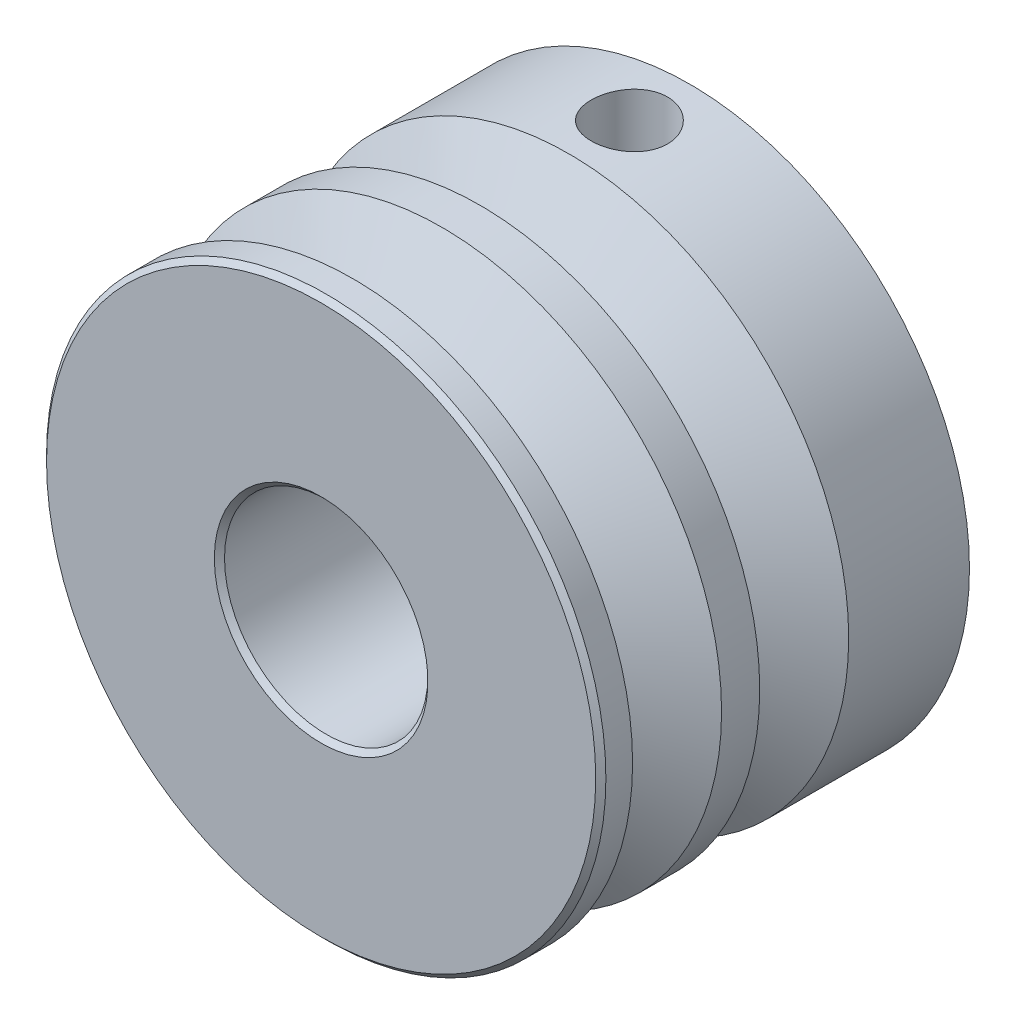
ISO-10303-21;
HEADER;
FILE_DESCRIPTION(('STEP AP214'),'2;1');
FILE_NAME('part.step','',(''),(''),'','','');
FILE_SCHEMA(('AUTOMOTIVE_DESIGN { 1 0 10303 214 1 1 1 1 }'));
ENDSEC;
DATA;
#1=APPLICATION_CONTEXT('core data for automotive mechanical design processes');
#2=APPLICATION_PROTOCOL_DEFINITION('international standard','automotive_design',2000,#1);
#3=PRODUCT_CONTEXT('',#1,'mechanical');
#4=PRODUCT('Part','Part','',(#3));
#5=PRODUCT_RELATED_PRODUCT_CATEGORY('part','',(#4));
#6=PRODUCT_DEFINITION_FORMATION('','',#4);
#7=PRODUCT_DEFINITION_CONTEXT('part definition',#1,'design');
#8=PRODUCT_DEFINITION('design','',#6,#7);
#9=PRODUCT_DEFINITION_SHAPE('','',#8);
#10=(LENGTH_UNIT() NAMED_UNIT(*) SI_UNIT(.MILLI.,.METRE.));
#11=(NAMED_UNIT(*) PLANE_ANGLE_UNIT() SI_UNIT($,.RADIAN.));
#12=(NAMED_UNIT(*) SI_UNIT($,.STERADIAN.) SOLID_ANGLE_UNIT());
#13=UNCERTAINTY_MEASURE_WITH_UNIT(LENGTH_MEASURE(1.E-05),#10,'distance_accuracy_value','');
#14=(GEOMETRIC_REPRESENTATION_CONTEXT(3) GLOBAL_UNCERTAINTY_ASSIGNED_CONTEXT((#13)) GLOBAL_UNIT_ASSIGNED_CONTEXT((#10,
#11,#12)) REPRESENTATION_CONTEXT('',''));
#15=CARTESIAN_POINT('',(0.,0.,0.));
#16=DIRECTION('',(0.,0.,1.));
#17=DIRECTION('',(1.,0.,0.));
#18=AXIS2_PLACEMENT_3D('',#15,#16,#17);
#19=CARTESIAN_POINT('',(0.,11.,0.));
#20=DIRECTION('',(0.,0.,-1.));
#21=DIRECTION('',(-1.,0.,0.));
#22=AXIS2_PLACEMENT_3D('',#19,#20,#21);
#23=PLANE('',#22);
#24=CARTESIAN_POINT('',(0.,0.,0.));
#25=DIRECTION('',(0.,0.,-1.));
#26=DIRECTION('',(-1.,0.,0.));
#27=AXIS2_PLACEMENT_3D('',#24,#25,#26);
#28=CIRCLE('',#27,10.8);
#29=CARTESIAN_POINT('',(-10.8,0.,0.));
#30=VERTEX_POINT('',#29);
#31=EDGE_CURVE('E58',#30,#30,#28,.F.);
#32=ORIENTED_EDGE('',*,*,#31,.T.);
#33=EDGE_LOOP('',(#32));
#34=FACE_BOUND('',#33,.T.);
#35=CARTESIAN_POINT('',(0.,0.,0.));
#36=DIRECTION('',(0.,0.,-1.));
#37=DIRECTION('',(-1.,0.,0.));
#38=AXIS2_PLACEMENT_3D('',#35,#36,#37);
#39=CIRCLE('',#38,4.2);
#40=CARTESIAN_POINT('',(-4.2,0.,0.));
#41=VERTEX_POINT('',#40);
#42=EDGE_CURVE('E61',#41,#41,#39,.T.);
#43=ORIENTED_EDGE('',*,*,#42,.T.);
#44=EDGE_LOOP('',(#43));
#45=FACE_BOUND('',#44,.T.);
#46=ADVANCED_FACE('F32',(#34,#45),#23,.F.);
#47=CARTESIAN_POINT('',(0.,0.,0.));
#48=DIRECTION('',(0.,0.,1.));
#49=DIRECTION('',(1.,0.,0.));
#50=AXIS2_PLACEMENT_3D('',#47,#48,#49);
#51=CYLINDRICAL_SURFACE('',#50,11.);
#52=CARTESIAN_POINT('',(0.,0.,-0.200000000000005));
#53=DIRECTION('',(0.,0.,-1.));
#54=DIRECTION('',(-1.,0.,0.));
#55=AXIS2_PLACEMENT_3D('',#52,#53,#54);
#56=CIRCLE('',#55,11.);
#57=CARTESIAN_POINT('',(-11.,0.,-0.200000000000005));
#58=VERTEX_POINT('',#57);
#59=EDGE_CURVE('E55',#58,#58,#56,.T.);
#60=ORIENTED_EDGE('',*,*,#59,.T.);
#61=EDGE_LOOP('',(#60));
#62=FACE_BOUND('',#61,.T.);
#63=CARTESIAN_POINT('',(0.,0.,-1.25));
#64=DIRECTION('',(0.,0.,1.));
#65=DIRECTION('',(1.,0.,0.));
#66=AXIS2_PLACEMENT_3D('',#63,#64,#65);
#67=CIRCLE('',#66,11.);
#68=CARTESIAN_POINT('',(11.,0.,-1.25));
#69=VERTEX_POINT('',#68);
#70=EDGE_CURVE('E186',#69,#69,#67,.T.);
#71=ORIENTED_EDGE('',*,*,#70,.T.);
#72=EDGE_LOOP('',(#71));
#73=FACE_BOUND('',#72,.T.);
#74=ADVANCED_FACE('F125',(#62,#73),#51,.T.);
#75=CARTESIAN_POINT('',(0.,0.,-2.91339745962156));
#76=DIRECTION('',(0.,0.,1.));
#77=DIRECTION('',(1.,0.,0.));
#78=AXIS2_PLACEMENT_3D('',#75,#76,#77);
#79=CONICAL_SURFACE('',#78,8.11891108675445,1.0471975511966);
#80=ORIENTED_EDGE('',*,*,#70,.F.);
#81=EDGE_LOOP('',(#80));
#82=FACE_BOUND('',#81,.T.);
#83=CARTESIAN_POINT('',(0.,0.,-2.91339745962156));
#84=DIRECTION('',(0.,0.,1.));
#85=DIRECTION('',(1.,0.,0.));
#86=AXIS2_PLACEMENT_3D('',#83,#84,#85);
#87=CIRCLE('',#86,8.11891108675445);
#88=CARTESIAN_POINT('',(8.11891108675445,0.,-2.91339745962156));
#89=VERTEX_POINT('',#88);
#90=EDGE_CURVE('E184',#89,#89,#87,.T.);
#91=ORIENTED_EDGE('',*,*,#90,.T.);
#92=EDGE_LOOP('',(#91));
#93=FACE_BOUND('',#92,.T.);
#94=ADVANCED_FACE('F131',(#82,#93),#79,.T.);
#95=CARTESIAN_POINT('',(0.,0.,-3.));
#96=DIRECTION('',(0.,0.,1.));
#97=DIRECTION('',(1.,0.,0.));
#98=AXIS2_PLACEMENT_3D('',#95,#96,#97);
#99=TOROIDAL_SURFACE('',#98,8.16891108675445,0.0999999999999997);
#100=ORIENTED_EDGE('',*,*,#90,.F.);
#101=EDGE_LOOP('',(#100));
#102=FACE_BOUND('',#101,.T.);
#103=CARTESIAN_POINT('',(0.,0.,-3.08660254037844));
#104=DIRECTION('',(0.,0.,1.));
#105=DIRECTION('',(1.,0.,0.));
#106=AXIS2_PLACEMENT_3D('',#103,#104,#105);
#107=CIRCLE('',#106,8.11891108675445);
#108=CARTESIAN_POINT('',(8.11891108675445,0.,-3.08660254037844));
#109=VERTEX_POINT('',#108);
#110=EDGE_CURVE('E181',#109,#109,#107,.T.);
#111=ORIENTED_EDGE('',*,*,#110,.T.);
#112=EDGE_LOOP('',(#111));
#113=FACE_BOUND('',#112,.T.);
#114=ADVANCED_FACE('F319',(#102,#113),#99,.F.);
#115=CARTESIAN_POINT('',(0.,0.,-4.75));
#116=DIRECTION('',(0.,0.,-1.));
#117=DIRECTION('',(-1.,0.,0.));
#118=AXIS2_PLACEMENT_3D('',#115,#116,#117);
#119=CONICAL_SURFACE('',#118,11.,1.0471975511966);
#120=ORIENTED_EDGE('',*,*,#110,.F.);
#121=EDGE_LOOP('',(#120));
#122=FACE_BOUND('',#121,.T.);
#123=CARTESIAN_POINT('',(0.,0.,-4.75));
#124=DIRECTION('',(0.,0.,1.));
#125=DIRECTION('',(1.,0.,0.));
#126=AXIS2_PLACEMENT_3D('',#123,#124,#125);
#127=CIRCLE('',#126,11.);
#128=CARTESIAN_POINT('',(11.,0.,-4.75));
#129=VERTEX_POINT('',#128);
#130=EDGE_CURVE('E178',#129,#129,#127,.T.);
#131=ORIENTED_EDGE('',*,*,#130,.T.);
#132=EDGE_LOOP('',(#131));
#133=FACE_BOUND('',#132,.T.);
#134=ADVANCED_FACE('F309',(#122,#133),#119,.T.);
#135=CARTESIAN_POINT('',(0.,0.,0.));
#136=DIRECTION('',(0.,0.,1.));
#137=DIRECTION('',(1.,0.,0.));
#138=AXIS2_PLACEMENT_3D('',#135,#136,#137);
#139=CYLINDRICAL_SURFACE('',#138,11.);
#140=ORIENTED_EDGE('',*,*,#130,.F.);
#141=EDGE_LOOP('',(#140));
#142=FACE_BOUND('',#141,.T.);
#143=CARTESIAN_POINT('',(0.,0.,-6.25));
#144=DIRECTION('',(0.,0.,1.));
#145=DIRECTION('',(1.,0.,0.));
#146=AXIS2_PLACEMENT_3D('',#143,#144,#145);
#147=CIRCLE('',#146,11.);
#148=CARTESIAN_POINT('',(11.,0.,-6.25));
#149=VERTEX_POINT('',#148);
#150=EDGE_CURVE('E175',#149,#149,#147,.T.);
#151=ORIENTED_EDGE('',*,*,#150,.T.);
#152=EDGE_LOOP('',(#151));
#153=FACE_BOUND('',#152,.T.);
#154=ADVANCED_FACE('F299',(#142,#153),#139,.T.);
#155=CARTESIAN_POINT('',(0.,0.,-7.91339745962155));
#156=DIRECTION('',(0.,0.,1.));
#157=DIRECTION('',(1.,0.,0.));
#158=AXIS2_PLACEMENT_3D('',#155,#156,#157);
#159=CONICAL_SURFACE('',#158,8.11891108675445,1.0471975511966);
#160=ORIENTED_EDGE('',*,*,#150,.F.);
#161=EDGE_LOOP('',(#160));
#162=FACE_BOUND('',#161,.T.);
#163=CARTESIAN_POINT('',(0.,0.,-7.91339745962155));
#164=DIRECTION('',(0.,0.,1.));
#165=DIRECTION('',(1.,0.,0.));
#166=AXIS2_PLACEMENT_3D('',#163,#164,#165);
#167=CIRCLE('',#166,8.11891108675445);
#168=CARTESIAN_POINT('',(8.11891108675445,0.,-7.91339745962155));
#169=VERTEX_POINT('',#168);
#170=EDGE_CURVE('E172',#169,#169,#167,.T.);
#171=ORIENTED_EDGE('',*,*,#170,.T.);
#172=EDGE_LOOP('',(#171));
#173=FACE_BOUND('',#172,.T.);
#174=ADVANCED_FACE('F289',(#162,#173),#159,.T.);
#175=CARTESIAN_POINT('',(0.,0.,-8.));
#176=DIRECTION('',(0.,0.,1.));
#177=DIRECTION('',(1.,0.,0.));
#178=AXIS2_PLACEMENT_3D('',#175,#176,#177);
#179=TOROIDAL_SURFACE('',#178,8.16891108675445,0.0999999999999981);
#180=ORIENTED_EDGE('',*,*,#170,.F.);
#181=EDGE_LOOP('',(#180));
#182=FACE_BOUND('',#181,.T.);
#183=CARTESIAN_POINT('',(0.,0.,-8.08660254037844));
#184=DIRECTION('',(0.,0.,1.));
#185=DIRECTION('',(1.,0.,0.));
#186=AXIS2_PLACEMENT_3D('',#183,#184,#185);
#187=CIRCLE('',#186,8.11891108675445);
#188=CARTESIAN_POINT('',(8.11891108675445,0.,-8.08660254037844));
#189=VERTEX_POINT('',#188);
#190=EDGE_CURVE('E169',#189,#189,#187,.T.);
#191=ORIENTED_EDGE('',*,*,#190,.T.);
#192=EDGE_LOOP('',(#191));
#193=FACE_BOUND('',#192,.T.);
#194=ADVANCED_FACE('F280',(#182,#193),#179,.F.);
#195=CARTESIAN_POINT('',(0.,0.,-9.75));
#196=DIRECTION('',(0.,0.,-1.));
#197=DIRECTION('',(-1.,0.,0.));
#198=AXIS2_PLACEMENT_3D('',#195,#196,#197);
#199=CONICAL_SURFACE('',#198,11.,1.0471975511966);
#200=ORIENTED_EDGE('',*,*,#190,.F.);
#201=EDGE_LOOP('',(#200));
#202=FACE_BOUND('',#201,.T.);
#203=CARTESIAN_POINT('',(0.,0.,-9.75));
#204=DIRECTION('',(0.,0.,1.));
#205=DIRECTION('',(1.,0.,0.));
#206=AXIS2_PLACEMENT_3D('',#203,#204,#205);
#207=CIRCLE('',#206,11.);
#208=CARTESIAN_POINT('',(11.,0.,-9.75));
#209=VERTEX_POINT('',#208);
#210=EDGE_CURVE('E164',#209,#209,#207,.T.);
#211=ORIENTED_EDGE('',*,*,#210,.T.);
#212=EDGE_LOOP('',(#211));
#213=FACE_BOUND('',#212,.T.);
#214=ADVANCED_FACE('F120',(#202,#213),#199,.T.);
#215=CARTESIAN_POINT('',(0.,0.,0.));
#216=DIRECTION('',(0.,0.,1.));
#217=DIRECTION('',(1.,0.,0.));
#218=AXIS2_PLACEMENT_3D('',#215,#216,#217);
#219=CYLINDRICAL_SURFACE('',#218,11.);
#220=CARTESIAN_POINT('',(-10.1872930440884,-4.14958557374924,-12.125));
#221=CARTESIAN_POINT('',(-10.1872924063143,-4.14958927355221,-12.0411656721093));
#222=CARTESIAN_POINT('',(-10.1846139494418,-4.15618166788674,-11.9572805572325));
#223=CARTESIAN_POINT('',(-10.173902136692,-4.18233275765829,-11.7918495253154));
#224=CARTESIAN_POINT('',(-10.1658633462332,-4.20190461222854,-11.7103060699751));
#225=CARTESIAN_POINT('',(-10.144465675881,-4.25330295590813,-11.5519772144858));
#226=CARTESIAN_POINT('',(-10.1311106104046,-4.28512065810401,-11.475188448405));
#227=CARTESIAN_POINT('',(-10.0991519899225,-4.35990537570059,-11.3284580312526));
#228=CARTESIAN_POINT('',(-10.0805492562889,-4.40287064618466,-11.2585153109347));
#229=CARTESIAN_POINT('',(-10.0381006908613,-4.4988103358803,-11.1269854050149));
#230=CARTESIAN_POINT('',(-10.0142244148774,-4.55184261130036,-11.0654502396641));
#231=CARTESIAN_POINT('',(-9.96153086806227,-4.6660313778769,-10.9529321943143));
#232=CARTESIAN_POINT('',(-9.93271334061782,-4.72718829093171,-10.9019498626576));
#233=CARTESIAN_POINT('',(-9.87040295699463,-4.85595236964055,-10.8117955951033));
#234=CARTESIAN_POINT('',(-9.83689207644456,-4.9235840682428,-10.7726711234281));
#235=CARTESIAN_POINT('',(-9.76587555737187,-5.06298196301673,-10.7076474318913));
#236=CARTESIAN_POINT('',(-9.72837009425263,-5.1347479775858,-10.6817476316194));
#237=CARTESIAN_POINT('',(-9.65043200710311,-5.27976254479022,-10.644064968034));
#238=CARTESIAN_POINT('',(-9.61001903987051,-5.35299910034509,-10.6321953041486));
#239=CARTESIAN_POINT('',(-9.52710461109783,-5.49921258058737,-10.6226406190359));
#240=CARTESIAN_POINT('',(-9.48460324650909,-5.57218951715891,-10.6249549399504));
#241=CARTESIAN_POINT('',(-9.39904506935259,-5.71531802657846,-10.6436334275864));
#242=CARTESIAN_POINT('',(-9.35599381658322,-5.78548513859694,-10.6599042295159));
#243=CARTESIAN_POINT('',(-9.270432287083,-5.92161743230781,-10.7058876010157));
#244=CARTESIAN_POINT('',(-9.22792202227474,-5.98758252152157,-10.7356004663042));
#245=CARTESIAN_POINT('',(-9.14476597668531,-6.11383622961715,-10.8077222024899));
#246=CARTESIAN_POINT('',(-9.10412653002809,-6.17410620112709,-10.8501710007936));
#247=CARTESIAN_POINT('',(-9.02633611874861,-6.28728714571441,-10.946530549453));
#248=CARTESIAN_POINT('',(-8.98918534448628,-6.34019771730072,-11.0004419247426));
#249=CARTESIAN_POINT('',(-8.91951746093717,-6.43784455019363,-11.1187180059203));
#250=CARTESIAN_POINT('',(-8.88704048627987,-6.48251084439923,-11.183164147509));
#251=CARTESIAN_POINT('',(-8.82841873503632,-6.5621242437776,-11.3204019593368));
#252=CARTESIAN_POINT('',(-8.80227398573086,-6.59707130707761,-11.3931936655287));
#253=CARTESIAN_POINT('',(-8.75743504365044,-6.65647987031888,-11.545133450801));
#254=CARTESIAN_POINT('',(-8.73874506924998,-6.68093543410797,-11.6242850983843));
#255=CARTESIAN_POINT('',(-8.70968595146963,-6.71877556754321,-11.7866570305724));
#256=CARTESIAN_POINT('',(-8.69931632768118,-6.73216077638173,-11.8698770799775));
#257=CARTESIAN_POINT('',(-8.68743012230503,-6.74749232987587,-12.0373088435069));
#258=CARTESIAN_POINT('',(-8.6858432058719,-6.74952955382982,-12.1215072516195));
#259=CARTESIAN_POINT('',(-8.69140750681531,-6.74236274058144,-12.2891314179332));
#260=CARTESIAN_POINT('',(-8.69855850148493,-6.73315898988269,-12.372557195772));
#261=CARTESIAN_POINT('',(-8.72121913970183,-6.70378065325772,-12.5359217325789));
#262=CARTESIAN_POINT('',(-8.7366946721512,-6.68365083558017,-12.6158732927462));
#263=CARTESIAN_POINT('',(-8.77528756204159,-6.63289820077761,-12.7704217246297));
#264=CARTESIAN_POINT('',(-8.79840523572655,-6.60227494941572,-12.8450183745958));
#265=CARTESIAN_POINT('',(-8.85145292992859,-6.53098461233909,-12.9872526062227));
#266=CARTESIAN_POINT('',(-8.88142467718762,-6.49025587096775,-13.0548437161264));
#267=CARTESIAN_POINT('',(-8.94685526414777,-6.39975709787257,-13.1806725024343));
#268=CARTESIAN_POINT('',(-8.98231435885005,-6.34998664595495,-13.2389097439009));
#269=CARTESIAN_POINT('',(-9.05757909207847,-6.24216346295103,-13.3447815268094));
#270=CARTESIAN_POINT('',(-9.09741275342395,-6.1840565052151,-13.3923409644625));
#271=CARTESIAN_POINT('',(-9.17971403120402,-6.06121345919488,-13.4749858890388));
#272=CARTESIAN_POINT('',(-9.22218158607638,-5.99647752582723,-13.510071667381));
#273=CARTESIAN_POINT('',(-9.30809086981875,-5.86223247176827,-13.5666510259285));
#274=CARTESIAN_POINT('',(-9.35152911606287,-5.79273899805192,-13.5881869936464));
#275=CARTESIAN_POINT('',(-9.43805429761706,-5.65066762503095,-13.6171930076761));
#276=CARTESIAN_POINT('',(-9.48114125181401,-5.57808989286934,-13.6246638152196));
#277=CARTESIAN_POINT('',(-9.5652997196082,-5.43249986299282,-13.6253113327712));
#278=CARTESIAN_POINT('',(-9.60638474268316,-5.3594958609591,-13.6186034568827));
#279=CARTESIAN_POINT('',(-9.68580702717041,-5.21459212408636,-13.5913297343614));
#280=CARTESIAN_POINT('',(-9.72414429321923,-5.14269238738417,-13.570763911113));
#281=CARTESIAN_POINT('',(-9.79717027584927,-5.00217219975876,-13.5163964072043));
#282=CARTESIAN_POINT('',(-9.83186080282362,-4.93355013098545,-13.4826013338351));
#283=CARTESIAN_POINT('',(-9.89696212817462,-4.80162042532497,-13.4027466977595));
#284=CARTESIAN_POINT('',(-9.92737283695578,-4.73831289970586,-13.3566868783562));
#285=CARTESIAN_POINT('',(-9.98368297571917,-4.61849514584561,-13.2531872132776));
#286=CARTESIAN_POINT('',(-10.0095455201091,-4.56204154993856,-13.1956617320395));
#287=CARTESIAN_POINT('',(-10.05618020155,-4.45830496600971,-13.0710431220091));
#288=CARTESIAN_POINT('',(-10.0769511372455,-4.41102414283375,-13.0039477411135));
#289=CARTESIAN_POINT('',(-10.1133077329706,-4.32702179775105,-12.8617351533139));
#290=CARTESIAN_POINT('',(-10.1288690928126,-4.29034986628278,-12.7865824541713));
#291=CARTESIAN_POINT('',(-10.1545696136845,-4.22916386844127,-12.6306762076501));
#292=CARTESIAN_POINT('',(-10.1647145563592,-4.20463684027498,-12.5499287367712));
#293=CARTESIAN_POINT('',(-10.177186415269,-4.17433157931287,-12.4114886017611));
#294=CARTESIAN_POINT('',(-10.1809750825459,-4.16506800676166,-12.3546617888032));
#295=CARTESIAN_POINT('',(-10.1860286038796,-4.15269376229378,-12.2402313114377));
#296=CARTESIAN_POINT('',(-10.1872934824939,-4.14958303050743,-12.1826276545947));
#297=CARTESIAN_POINT('',(-10.1872930440884,-4.14958557374924,-12.125));
#298=B_SPLINE_CURVE_WITH_KNOTS('',3,(#220,#221,#222,#223,#224,#225,#226,#227,#228,#229,#230,
#231,#232,#233,#234,#235,#236,#237,#238,#239,#240,#241,#242,#243,#244,#245,#246,#247,#248,#249,
#250,#251,#252,#253,#254,#255,#256,#257,#258,#259,#260,#261,#262,#263,#264,#265,#266,#267,#268,
#269,#270,#271,#272,#273,#274,#275,#276,#277,#278,#279,#280,#281,#282,#283,#284,#285,#286,#287,
#288,#289,#290,#291,#292,#293,#294,#295,#296,#297),.UNSPECIFIED.,.T.,.F.,(4,2,2,2,2,2,2,2,2,2,2,
2,2,2,2,2,2,2,2,2,2,2,2,2,2,2,2,2,2,2,2,2,2,2,2,2,2,2,4),(0.,0.25129241365235,0.502839988614743,
0.75420740305446,1.00553549494109,1.25835430174808,1.51118624213232,1.76501723524538,
2.01883708715132,2.27107826705025,2.52330774799943,2.77386293073415,3.02442362581394,
3.27577819064357,3.52714646271319,3.78055871311718,4.0339720552646,4.28752859167033,
4.54107048692648,4.79257896376818,5.04408103043813,5.29456029222844,5.54504992054628,
5.79710712919644,6.0491760546538,6.30296596167163,6.55674993906899,6.80973601099931,
7.06270839047516,7.31362951480919,7.56455021573108,7.81534575497384,8.06614654369502,
8.31889590223288,8.57170483921668,8.82567709259412,9.07937770366508,9.25211760261265,
9.42485582072179),.UNSPECIFIED.);
#299=CARTESIAN_POINT('',(-10.1872930440884,-4.14958557374924,-12.125));
#300=VERTEX_POINT('',#299);
#301=EDGE_CURVE('E65',#300,#300,#298,.T.);
#302=ORIENTED_EDGE('',*,*,#301,.T.);
#303=EDGE_LOOP('',(#302));
#304=FACE_BOUND('',#303,.T.);
#305=CARTESIAN_POINT('',(0.,11.,-13.625));
#306=CARTESIAN_POINT('',(0.0838384134298601,10.9999987467262,-13.6249964805426));
#307=CARTESIAN_POINT('',(0.167727602289745,10.9990314271488,-13.6179474073274));
#308=CARTESIAN_POINT('',(0.33316709764141,10.9952656640845,-13.5899411167757));
#309=CARTESIAN_POINT('',(0.414714945659854,10.992465364401,-13.5689698005502));
#310=CARTESIAN_POINT('',(0.57305309369359,10.9853487739829,-13.5137522661594));
#311=CARTESIAN_POINT('',(0.649846722453222,10.9810335583919,-13.4795154607979));
#312=CARTESIAN_POINT('',(0.796585302449724,10.971365727223,-13.3987604754398));
#313=CARTESIAN_POINT('',(0.866531328858714,10.9660132749006,-13.3522442277457));
#314=CARTESIAN_POINT('',(0.998057563812241,10.9548285996925,-13.2479277857077));
#315=CARTESIAN_POINT('',(1.05958678462376,10.9489937690522,-13.1900635769965));
#316=CARTESIAN_POINT('',(1.17209333908043,10.9375227155932,-13.0648313892076));
#317=CARTESIAN_POINT('',(1.22307010612798,10.9318865034525,-12.9974629001387));
#318=CARTESIAN_POINT('',(1.31321850524922,10.9214253777188,-12.8547980617759));
#319=CARTESIAN_POINT('',(1.35234166468403,10.916603830108,-12.7794708149948));
#320=CARTESIAN_POINT('',(1.41736264485277,10.9083529406776,-12.6232381846263));
#321=CARTESIAN_POINT('',(1.44326106107984,10.904923536173,-12.5423330523902));
#322=CARTESIAN_POINT('',(1.48094090555089,10.8998704969217,-12.3777737564264));
#323=CARTESIAN_POINT('',(1.49280898864548,10.8982357822449,-12.2941397807089));
#324=CARTESIAN_POINT('',(1.50235955059666,10.8969234380482,-12.1260525269759));
#325=CARTESIAN_POINT('',(1.50004270497975,10.8972457153308,-12.0415992881672));
#326=CARTESIAN_POINT('',(1.48136017019239,10.8998008033656,-11.8748782743991));
#327=CARTESIAN_POINT('',(1.46509038917589,10.9020205710196,-11.7925995236328));
#328=CARTESIAN_POINT('',(1.41911367695299,10.9081001740818,-11.6319509594674));
#329=CARTESIAN_POINT('',(1.38940642650252,10.911960048455,-11.553581238987));
#330=CARTESIAN_POINT('',(1.31729641760207,10.920899582937,-11.4026800739624));
#331=CARTESIAN_POINT('',(1.2748524385776,10.9259831927575,-11.330168570732));
#332=CARTESIAN_POINT('',(1.1785032304482,10.9367944433469,-11.1932608511142));
#333=CARTESIAN_POINT('',(1.12459737823041,10.9425221191218,-11.1288650762333));
#334=CARTESIAN_POINT('',(1.00632527783799,10.954033973898,-11.0094604455054));
#335=CARTESIAN_POINT('',(0.941876450734222,10.9598182294108,-10.9545333596876));
#336=CARTESIAN_POINT('',(0.804630944405404,10.9707474705779,-10.8562635084016));
#337=CARTESIAN_POINT('',(0.731834239164635,10.9758924542398,-10.812920779037));
#338=CARTESIAN_POINT('',(0.579892969480446,10.9849675408771,-10.73904813682));
#339=CARTESIAN_POINT('',(0.500745632131286,10.9888971094847,-10.7085238576073));
#340=CARTESIAN_POINT('',(0.338383087939893,10.9950939520307,-10.6612221620544));
#341=CARTESIAN_POINT('',(0.255168108280129,10.997361318692,-10.6444439789065));
#342=CARTESIAN_POINT('',(0.087738907367673,10.9999661380375,-10.6252179154344));
#343=CARTESIAN_POINT('',(0.00353783638784458,11.0003187469014,-10.6226574914114));
#344=CARTESIAN_POINT('',(-0.164092294089252,10.9990953877098,-10.6316418783307));
#345=CARTESIAN_POINT('',(-0.247521373180416,10.9975194687383,-10.6431863302829));
#346=CARTESIAN_POINT('',(-0.410903378364943,10.9926255265792,-10.6799592232097));
#347=CARTESIAN_POINT('',(-0.490868720620555,10.9893144012332,-10.7051334955713));
#348=CARTESIAN_POINT('',(-0.645443141095582,10.9813204406364,-10.7683947590329));
#349=CARTESIAN_POINT('',(-0.72005200642521,10.9766375509031,-10.8064822630172));
#350=CARTESIAN_POINT('',(-0.862294892982454,10.9663836303603,-10.894757538724));
#351=CARTESIAN_POINT('',(-0.929883728353238,10.960807370571,-10.9450175028004));
#352=CARTESIAN_POINT('',(-1.0557070132546,10.9494055314268,-11.0561095779574));
#353=CARTESIAN_POINT('',(-1.11394101745331,10.9435799402192,-11.1169421920567));
#354=CARTESIAN_POINT('',(-1.21980532954112,10.9322886877303,-11.2479508330084));
#355=CARTESIAN_POINT('',(-1.26736066380641,10.9268257501214,-11.3181877134811));
#356=CARTESIAN_POINT('',(-1.34999839549264,10.9169246504416,-11.4657183076998));
#357=CARTESIAN_POINT('',(-1.38508108196141,10.9124864646235,-11.5430118578586));
#358=CARTESIAN_POINT('',(-1.44165849505152,10.9051564726067,-11.7022277566732));
#359=CARTESIAN_POINT('',(-1.46319427050012,10.902259998972,-11.7841352944361));
#360=CARTESIAN_POINT('',(-1.49219810547518,10.8983284316023,-11.950446521828));
#361=CARTESIAN_POINT('',(-1.499666954979,10.8972932333409,-12.0348500710144));
#362=CARTESIAN_POINT('',(-1.50030856584717,10.8972048541528,-12.203010975391));
#363=CARTESIAN_POINT('',(-1.49359914690636,10.8981353386205,-12.2867678966084));
#364=CARTESIAN_POINT('',(-1.46632546438533,10.9018382005365,-12.4519511386985));
#365=CARTESIAN_POINT('',(-1.44576120871188,10.9046105769335,-12.5333774609011));
#366=CARTESIAN_POINT('',(-1.39140056450479,10.9116795081979,-12.6915651393851));
#367=CARTESIAN_POINT('',(-1.3576109698069,10.9159752803929,-12.7683288674825));
#368=CARTESIAN_POINT('',(-1.27777039839119,10.925608111245,-12.9151162986064));
#369=CARTESIAN_POINT('',(-1.23171915365824,10.9309451926623,-12.9851398542605));
#370=CARTESIAN_POINT('',(-1.12822915223083,10.9421122992185,-13.1170600365998));
#371=CARTESIAN_POINT('',(-1.07070278423402,10.9479459056036,-13.1788876362225));
#372=CARTESIAN_POINT('',(-0.946079868053619,10.9594178730356,-13.2920553467108));
#373=CARTESIAN_POINT('',(-0.878981081957847,10.9650561880416,-13.3433929983114));
#374=CARTESIAN_POINT('',(-0.736765493201997,10.9755309296992,-13.4343259673834));
#375=CARTESIAN_POINT('',(-0.661613818517361,10.9803636164562,-13.4738671582763));
#376=CARTESIAN_POINT('',(-0.505709693930314,10.9886453705716,-13.539709481053));
#377=CARTESIAN_POINT('',(-0.424963312021875,10.9920959102772,-13.5660247096937));
#378=CARTESIAN_POINT('',(-0.286518597087188,10.9964117606731,-13.5985104370639));
#379=CARTESIAN_POINT('',(-0.229685788696071,10.9977506427886,-13.6084293607973));
#380=CARTESIAN_POINT('',(-0.115243313646886,10.9995451890738,-13.6216753209812));
#381=CARTESIAN_POINT('',(-0.0576336542976996,11.0000008615472,-13.6250024194063));
#382=CARTESIAN_POINT('',(0.,11.,-13.625));
#383=B_SPLINE_CURVE_WITH_KNOTS('',3,(#305,#306,#307,#308,#309,#310,#311,#312,#313,#314,#315,
#316,#317,#318,#319,#320,#321,#322,#323,#324,#325,#326,#327,#328,#329,#330,#331,#332,#333,#334,
#335,#336,#337,#338,#339,#340,#341,#342,#343,#344,#345,#346,#347,#348,#349,#350,#351,#352,#353,
#354,#355,#356,#357,#358,#359,#360,#361,#362,#363,#364,#365,#366,#367,#368,#369,#370,#371,#372,
#373,#374,#375,#376,#377,#378,#379,#380,#381,#382),.UNSPECIFIED.,.T.,.F.,(4,2,2,2,2,2,2,2,2,2,2,
2,2,2,2,2,2,2,2,2,2,2,2,2,2,2,2,2,2,2,2,2,2,2,2,2,2,2,4),(0.,0.251304688086149,
0.502864258429489,0.754245655375314,1.00558751830524,1.25839025869502,1.51120656941611,
1.76504317927171,2.01886835818388,2.27111752000616,2.5233546691019,2.77387178872722,
3.02439486038873,3.27573762185032,3.52709405079552,3.78052284746837,4.03395243396007,
4.28749328511459,4.54101999186668,4.79253696204822,5.04404753088006,5.2945657880954,
5.54509399649479,5.79714607697888,6.0492101527175,6.30299215129404,6.55676826820726,
6.80977166004948,7.06276084317856,7.31365598745056,7.56455098853988,7.81531727406237,
8.06608904128416,8.31885423544364,8.57167862009405,8.82564582024672,9.07934175494254,
9.25209960062618,9.42485582207669),.UNSPECIFIED.);
#384=CARTESIAN_POINT('',(0.,11.,-13.625));
#385=VERTEX_POINT('',#384);
#386=EDGE_CURVE('E64',#385,#385,#383,.T.);
#387=ORIENTED_EDGE('',*,*,#386,.T.);
#388=EDGE_LOOP('',(#387));
#389=FACE_BOUND('',#388,.T.);
#390=ORIENTED_EDGE('',*,*,#210,.F.);
#391=EDGE_LOOP('',(#390));
#392=FACE_BOUND('',#391,.T.);
#393=CARTESIAN_POINT('',(0.,0.,-14.5));
#394=DIRECTION('',(0.,0.,1.));
#395=DIRECTION('',(1.,0.,0.));
#396=AXIS2_PLACEMENT_3D('',#393,#394,#395);
#397=CIRCLE('',#396,11.);
#398=CARTESIAN_POINT('',(11.,0.,-14.5));
#399=VERTEX_POINT('',#398);
#400=EDGE_CURVE('E161',#399,#399,#397,.T.);
#401=ORIENTED_EDGE('',*,*,#400,.T.);
#402=EDGE_LOOP('',(#401));
#403=FACE_BOUND('',#402,.T.);
#404=ADVANCED_FACE('F79',(#304,#389,#392,#403),#219,.T.);
#405=CARTESIAN_POINT('',(0.,11.,-14.5));
#406=DIRECTION('',(0.,0.,1.));
#407=DIRECTION('',(1.,0.,0.));
#408=AXIS2_PLACEMENT_3D('',#405,#406,#407);
#409=PLANE('',#408);
#410=ORIENTED_EDGE('',*,*,#400,.F.);
#411=EDGE_LOOP('',(#410));
#412=FACE_BOUND('',#411,.T.);
#413=CARTESIAN_POINT('',(0.,0.,-14.5));
#414=DIRECTION('',(0.,0.,1.));
#415=DIRECTION('',(1.,0.,0.));
#416=AXIS2_PLACEMENT_3D('',#413,#414,#415);
#417=CIRCLE('',#416,5.);
#418=CARTESIAN_POINT('',(5.,0.,-14.5));
#419=VERTEX_POINT('',#418);
#420=EDGE_CURVE('E159',#419,#419,#417,.T.);
#421=ORIENTED_EDGE('',*,*,#420,.T.);
#422=EDGE_LOOP('',(#421));
#423=FACE_BOUND('',#422,.T.);
#424=ADVANCED_FACE('F114',(#412,#423),#409,.F.);
#425=CARTESIAN_POINT('',(0.,0.,0.));
#426=DIRECTION('',(0.,0.,1.));
#427=DIRECTION('',(1.,0.,0.));
#428=AXIS2_PLACEMENT_3D('',#425,#426,#427);
#429=CYLINDRICAL_SURFACE('',#428,5.);
#430=CARTESIAN_POINT('',(0.,0.,-14.8));
#431=DIRECTION('',(0.,0.,1.));
#432=DIRECTION('',(1.,0.,0.));
#433=AXIS2_PLACEMENT_3D('',#430,#431,#432);
#434=CIRCLE('',#433,5.);
#435=CARTESIAN_POINT('',(5.,0.,-14.8));
#436=VERTEX_POINT('',#435);
#437=EDGE_CURVE('E10',#436,#436,#434,.T.);
#438=ORIENTED_EDGE('',*,*,#437,.T.);
#439=EDGE_LOOP('',(#438));
#440=FACE_BOUND('',#439,.T.);
#441=ORIENTED_EDGE('',*,*,#420,.F.);
#442=EDGE_LOOP('',(#441));
#443=FACE_BOUND('',#442,.T.);
#444=ADVANCED_FACE('F112',(#440,#443),#429,.T.);
#445=CARTESIAN_POINT('',(0.,5.,-15.));
#446=DIRECTION('',(0.,0.,1.));
#447=DIRECTION('',(1.,0.,0.));
#448=AXIS2_PLACEMENT_3D('',#445,#446,#447);
#449=PLANE('',#448);
#450=CARTESIAN_POINT('',(0.,0.,-15.));
#451=DIRECTION('',(0.,0.,1.));
#452=DIRECTION('',(1.,0.,0.));
#453=AXIS2_PLACEMENT_3D('',#450,#451,#452);
#454=CIRCLE('',#453,4.2);
#455=CARTESIAN_POINT('',(4.2,0.,-15.));
#456=VERTEX_POINT('',#455);
#457=EDGE_CURVE('E39',#456,#456,#454,.T.);
#458=ORIENTED_EDGE('',*,*,#457,.T.);
#459=EDGE_LOOP('',(#458));
#460=FACE_BOUND('',#459,.T.);
#461=CARTESIAN_POINT('',(0.,0.,-15.));
#462=DIRECTION('',(0.,0.,1.));
#463=DIRECTION('',(1.,0.,0.));
#464=AXIS2_PLACEMENT_3D('',#461,#462,#463);
#465=CIRCLE('',#464,4.8);
#466=CARTESIAN_POINT('',(4.8,0.,-15.));
#467=VERTEX_POINT('',#466);
#468=EDGE_CURVE('E43',#467,#467,#465,.F.);
#469=ORIENTED_EDGE('',*,*,#468,.T.);
#470=EDGE_LOOP('',(#469));
#471=FACE_BOUND('',#470,.T.);
#472=ADVANCED_FACE('F107',(#460,#471),#449,.F.);
#473=CARTESIAN_POINT('',(0.,0.,0.));
#474=DIRECTION('',(0.,0.,1.));
#475=DIRECTION('',(1.,0.,0.));
#476=AXIS2_PLACEMENT_3D('',#473,#474,#475);
#477=CYLINDRICAL_SURFACE('',#476,4.);
#478=CARTESIAN_POINT('',(0.,0.,-0.200000000000004));
#479=DIRECTION('',(0.,0.,-1.));
#480=DIRECTION('',(-1.,0.,0.));
#481=AXIS2_PLACEMENT_3D('',#478,#479,#480);
#482=CIRCLE('',#481,4.);
#483=CARTESIAN_POINT('',(-4.,0.,-0.200000000000004));
#484=VERTEX_POINT('',#483);
#485=EDGE_CURVE('E47',#484,#484,#482,.F.);
#486=ORIENTED_EDGE('',*,*,#485,.T.);
#487=EDGE_LOOP('',(#486));
#488=FACE_BOUND('',#487,.T.);
#489=CARTESIAN_POINT('',(0.,0.,-14.8));
#490=DIRECTION('',(0.,0.,1.));
#491=DIRECTION('',(1.,0.,0.));
#492=AXIS2_PLACEMENT_3D('',#489,#490,#491);
#493=CIRCLE('',#492,4.);
#494=CARTESIAN_POINT('',(4.,0.,-14.8));
#495=VERTEX_POINT('',#494);
#496=EDGE_CURVE('E52',#495,#495,#493,.F.);
#497=ORIENTED_EDGE('',*,*,#496,.T.);
#498=EDGE_LOOP('',(#497));
#499=FACE_BOUND('',#498,.T.);
#500=CARTESIAN_POINT('',(-3.96130814466628,-0.555011516097283,-12.125));
#501=CARTESIAN_POINT('',(-3.96130720810109,-0.555007463856237,-12.2060074837208));
#502=CARTESIAN_POINT('',(-3.9603399893557,-0.562055128008877,-12.2869949225036));
#503=CARTESIAN_POINT('',(-3.95630141064532,-0.589808132805242,-12.4465280829132));
#504=CARTESIAN_POINT('',(-3.95323011369876,-0.610513064404719,-12.525073877595));
#505=CARTESIAN_POINT('',(-3.94453216714249,-0.664379480037454,-12.6773753716135));
#506=CARTESIAN_POINT('',(-3.93891163423947,-0.697511114358295,-12.7511420566511));
#507=CARTESIAN_POINT('',(-3.92445860546671,-0.774700987262726,-12.8923718968188));
#508=CARTESIAN_POINT('',(-3.91562514450799,-0.818762507664412,-12.9598331502825));
#509=CARTESIAN_POINT('',(-3.89350758628216,-0.9183185342187,-13.0898903116228));
#510=CARTESIAN_POINT('',(-3.88004038395378,-0.974239758045086,-13.1521285296294));
#511=CARTESIAN_POINT('',(-3.84794131425105,-1.09416515174477,-13.2667228146715));
#512=CARTESIAN_POINT('',(-3.82930834728737,-1.15817104094638,-13.3190767737419));
#513=CARTESIAN_POINT('',(-3.78545493916524,-1.29445719433431,-13.4141395122956));
#514=CARTESIAN_POINT('',(-3.76003191866688,-1.3669449032584,-13.4564594747159));
#515=CARTESIAN_POINT('',(-3.70253174529311,-1.51578705999261,-13.5276511725249));
#516=CARTESIAN_POINT('',(-3.67045690577499,-1.59214015654579,-13.556527571992));
#517=CARTESIAN_POINT('',(-3.60134795360387,-1.74265631069268,-13.5987578957746));
#518=CARTESIAN_POINT('',(-3.56458742291358,-1.81677177978816,-13.6127276274404));
#519=CARTESIAN_POINT('',(-3.4858881754719,-1.96354485273789,-13.626721200945));
#520=CARTESIAN_POINT('',(-3.4439511469682,-2.036202922964,-13.6267495776187));
#521=CARTESIAN_POINT('',(-3.35841297437009,-2.17424341367037,-13.6132182385348));
#522=CARTESIAN_POINT('',(-3.31499680535632,-2.23980794612798,-13.6003307020512));
#523=CARTESIAN_POINT('',(-3.22620518106348,-2.36591420940135,-13.5624640847744));
#524=CARTESIAN_POINT('',(-3.18082958724794,-2.42645558417976,-13.537484147738));
#525=CARTESIAN_POINT('',(-3.08916882526744,-2.54215802482953,-13.4758295483241));
#526=CARTESIAN_POINT('',(-3.04288002971955,-2.59722797659058,-13.4389899947316));
#527=CARTESIAN_POINT('',(-2.95189628278888,-2.70019186404152,-13.3548079030706));
#528=CARTESIAN_POINT('',(-2.90720185095396,-2.74808347654626,-13.3074619769824));
#529=CARTESIAN_POINT('',(-2.81876773537134,-2.83880166071729,-13.2003727137168));
#530=CARTESIAN_POINT('',(-2.77523692595569,-2.88116791648113,-13.1400660843496));
#531=CARTESIAN_POINT('',(-2.69428496611585,-2.95701076153279,-13.0104070066784));
#532=CARTESIAN_POINT('',(-2.65686535077519,-2.990485118565,-12.9410522934134));
#533=CARTESIAN_POINT('',(-2.58959965255528,-3.04893590051823,-12.7932805325372));
#534=CARTESIAN_POINT('',(-2.55994010626835,-3.07370721461546,-12.7146965063139));
#535=CARTESIAN_POINT('',(-2.51148579624154,-3.11342777100211,-12.5519037748324));
#536=CARTESIAN_POINT('',(-2.49268498716521,-3.12838247908132,-12.4676982284063));
#537=CARTESIAN_POINT('',(-2.46821223690476,-3.14772294627468,-12.301024037684));
#538=CARTESIAN_POINT('',(-2.46187316097441,-3.15264630823285,-12.2187158944639));
#539=CARTESIAN_POINT('',(-2.46081619791849,-3.153472107617,-12.0539906432583));
#540=CARTESIAN_POINT('',(-2.46609540672507,-3.14937679931967,-11.9715735676475));
#541=CARTESIAN_POINT('',(-2.48730688939525,-3.13264572614602,-11.8130700777123));
#542=CARTESIAN_POINT('',(-2.50272157634247,-3.12042459690493,-11.7368688642353));
#543=CARTESIAN_POINT('',(-2.54260186630238,-3.08801412507205,-11.5886520552798));
#544=CARTESIAN_POINT('',(-2.56706932362582,-3.06782314993205,-11.5166373208319));
#545=CARTESIAN_POINT('',(-2.62462049032872,-3.0187488224859,-11.3758355619238));
#546=CARTESIAN_POINT('',(-2.65799279218986,-2.9895680156166,-11.3072707078627));
#547=CARTESIAN_POINT('',(-2.73100059331263,-2.92302450276759,-11.177871018274));
#548=CARTESIAN_POINT('',(-2.77063838384807,-2.88565880165615,-11.1170390253754));
#549=CARTESIAN_POINT('',(-2.85690493535609,-2.80035643063265,-11.0008316268049));
#550=CARTESIAN_POINT('',(-2.90381758314476,-2.75189979722195,-10.9460465912313));
#551=CARTESIAN_POINT('',(-3.00021880221452,-2.64646610000704,-10.8481616324106));
#552=CARTESIAN_POINT('',(-3.04970738184778,-2.58948900857505,-10.8050617470542));
#553=CARTESIAN_POINT('',(-3.14877503458351,-2.46806137258794,-10.7320539438004));
#554=CARTESIAN_POINT('',(-3.19835320140026,-2.40363738138437,-10.7021008762074));
#555=CARTESIAN_POINT('',(-3.29552329593961,-2.26857494815717,-10.6563435861501));
#556=CARTESIAN_POINT('',(-3.343116147035,-2.19793944371971,-10.6405327145776));
#557=CARTESIAN_POINT('',(-3.43167983708323,-2.05672431320363,-10.6242255972452));
#558=CARTESIAN_POINT('',(-3.47287495506143,-1.9863813485754,-10.622890516941));
#559=CARTESIAN_POINT('',(-3.55048607404192,-1.84407552437811,-10.6334151594454));
#560=CARTESIAN_POINT('',(-3.58690265084062,-1.77211286120317,-10.6452732908859));
#561=CARTESIAN_POINT('',(-3.65337184717305,-1.63059613382994,-10.6812588514936));
#562=CARTESIAN_POINT('',(-3.68355804631942,-1.56102613870596,-10.7050799058784));
#563=CARTESIAN_POINT('',(-3.73845228450607,-1.42456637398335,-10.7640100133844));
#564=CARTESIAN_POINT('',(-3.76315928504274,-1.35767711444468,-10.7991212033048));
#565=CARTESIAN_POINT('',(-3.80821419479347,-1.22579189451419,-10.8813139435048));
#566=CARTESIAN_POINT('',(-3.82833520519278,-1.16099371837806,-10.9288366405142));
#567=CARTESIAN_POINT('',(-3.86339259590082,-1.03839788821126,-11.0338078301876));
#568=CARTESIAN_POINT('',(-3.87832711983948,-0.9806027455463,-11.0912598658079));
#569=CARTESIAN_POINT('',(-3.90442223795193,-0.871104904448981,-11.2180641316451));
#570=CARTESIAN_POINT('',(-3.91534204628002,-0.819884753815512,-11.2878844021543));
#571=CARTESIAN_POINT('',(-3.93319083956132,-0.729480130088078,-11.4354158695733));
#572=CARTESIAN_POINT('',(-3.94011941053242,-0.690296905693852,-11.5131278840535));
#573=CARTESIAN_POINT('',(-3.9510879501083,-0.624560322304591,-11.6779556809754));
#574=CARTESIAN_POINT('',(-3.9549879658174,-0.598635965697997,-11.7653343665118));
#575=CARTESIAN_POINT('',(-3.96009770019931,-0.563869467044453,-11.9434852719558));
#576=CARTESIAN_POINT('',(-3.96130919380896,-0.555016055427909,-12.03425521271));
#577=CARTESIAN_POINT('',(-3.96130814466628,-0.555011516097283,-12.125));
#578=B_SPLINE_CURVE_WITH_KNOTS('',3,(#500,#501,#502,#503,#504,#505,#506,#507,#508,#509,#510,
#511,#512,#513,#514,#515,#516,#517,#518,#519,#520,#521,#522,#523,#524,#525,#526,#527,#528,#529,
#530,#531,#532,#533,#534,#535,#536,#537,#538,#539,#540,#541,#542,#543,#544,#545,#546,#547,#548,
#549,#550,#551,#552,#553,#554,#555,#556,#557,#558,#559,#560,#561,#562,#563,#564,#565,#566,#567,
#568,#569,#570,#571,#572,#573,#574,#575,#576,#577),.UNSPECIFIED.,.T.,.F.,(4,2,2,2,2,2,2,2,2,2,2,
2,2,2,2,2,2,2,2,2,2,2,2,2,2,2,2,2,2,2,2,2,2,2,2,2,2,2,4),(0.,0.242684541416169,
0.485361814598852,0.727459856757025,0.969630679682929,1.22274652401127,1.47591628822982,
1.7377007213642,1.99939426381329,2.24980018489678,2.50012465404856,2.73806472803193,
2.97602165263334,3.21744131210666,3.45893893628974,3.71456675065873,3.97025867827333,
4.23162592252964,4.49284751635472,4.73965657740483,4.98640395388882,5.22143845928196,
5.45652113429523,5.70041561005819,5.94439948466352,6.20385016993621,6.46330169650175,
6.72185508890165,6.98028685560123,7.22365720549932,7.46699820319476,7.70440274003887,
7.94185223512827,8.18928323676983,8.4368027089496,8.69738599542075,8.95799630544238,
9.23003178870922,9.50188762323048),.UNSPECIFIED.);
#579=CARTESIAN_POINT('',(-3.96130814466628,-0.555011516097283,-12.125));
#580=VERTEX_POINT('',#579);
#581=EDGE_CURVE('E73',#580,#580,#578,.T.);
#582=ORIENTED_EDGE('',*,*,#581,.T.);
#583=EDGE_LOOP('',(#582));
#584=FACE_BOUND('',#583,.T.);
#585=CARTESIAN_POINT('',(0.,4.,-13.625));
#586=CARTESIAN_POINT('',(-0.0812350589378524,4.00000217456151,-13.6250029023031));
#587=CARTESIAN_POINT('',(-0.162450241781791,3.99750379283184,-13.6183802397516));
#588=CARTESIAN_POINT('',(-0.322453452352359,3.98778696006927,-13.5921718047301));
#589=CARTESIAN_POINT('',(-0.401241827987614,3.98056918893993,-13.5725878995294));
#590=CARTESIAN_POINT('',(-0.554060784990876,3.96218832391545,-13.5212469982282));
#591=CARTESIAN_POINT('',(-0.628100224162275,3.9510328434944,-13.4895134831782));
#592=CARTESIAN_POINT('',(-0.76979931016025,3.92588767765353,-13.4148935869842));
#593=CARTESIAN_POINT('',(-0.837457239177875,3.91189723227548,-13.3720042144558));
#594=CARTESIAN_POINT('',(-0.96734641704582,3.88186246971217,-13.2743874689291));
#595=CARTESIAN_POINT('',(-1.02927073015119,3.86576002583566,-13.2192697377406));
#596=CARTESIAN_POINT('',(-1.14324421474362,3.83360220871327,-13.0995895653412));
#597=CARTESIAN_POINT('',(-1.19529036359202,3.81754685135033,-13.0350242439121));
#598=CARTESIAN_POINT('',(-1.28998202215984,3.78662470617731,-12.8952825324768));
#599=CARTESIAN_POINT('',(-1.33219393195759,3.77182648820818,-12.8197956334542));
#600=CARTESIAN_POINT('',(-1.40318646334084,3.74599860237433,-12.6621516458315));
#601=CARTESIAN_POINT('',(-1.43197244961238,3.73496742975881,-12.5799972368449));
#602=CARTESIAN_POINT('',(-1.47408431017548,3.71854412824136,-12.4148832597418));
#603=CARTESIAN_POINT('',(-1.48799593218557,3.71293924350838,-12.3320949615646));
#604=CARTESIAN_POINT('',(-1.50179556531647,3.70738061461215,-12.1651838420062));
#605=CARTESIAN_POINT('',(-1.5016893680263,3.70742453659305,-12.0810615861255));
#606=CARTESIAN_POINT('',(-1.48790429610017,3.71297511632055,-11.919230474787));
#607=CARTESIAN_POINT('',(-1.47503808509003,3.71815468871122,-11.8414390939558));
#608=CARTESIAN_POINT('',(-1.43744167868329,3.7328493805953,-11.6892128495947));
#609=CARTESIAN_POINT('',(-1.41270969663258,3.74236515298863,-11.6147784933861));
#610=CARTESIAN_POINT('',(-1.35163748571903,3.76485702190253,-11.4697229322718));
#611=CARTESIAN_POINT('',(-1.315086487371,3.77789517988166,-11.3992005138787));
#612=CARTESIAN_POINT('',(-1.23156073762697,3.80594210139319,-11.265054262409));
#613=CARTESIAN_POINT('',(-1.18458238728896,3.82095154457158,-11.2014328224803));
#614=CARTESIAN_POINT('',(-1.07781780766548,3.85248038859113,-11.0783963363491));
#615=CARTESIAN_POINT('',(-1.01738298716955,3.86903347455671,-11.0195513592519));
#616=CARTESIAN_POINT('',(-0.887312590819015,3.90091728164085,-10.9126620337942));
#617=CARTESIAN_POINT('',(-0.817675603497359,3.91624781465952,-10.8646193453943));
#618=CARTESIAN_POINT('',(-0.669723436992415,3.9442639480908,-10.7800696029375));
#619=CARTESIAN_POINT('',(-0.591290713844715,3.95690498259616,-10.7437524187789));
#620=CARTESIAN_POINT('',(-0.42883685052458,3.97778718326962,-10.68501739573));
#621=CARTESIAN_POINT('',(-0.344818210845765,3.98603030341493,-10.6625933834389));
#622=CARTESIAN_POINT('',(-0.178375243148663,3.99684443228065,-10.6333772124581));
#623=CARTESIAN_POINT('',(-0.0961036195622076,3.99969369025686,-10.6258173936175));
#624=CARTESIAN_POINT('',(0.0685724752550252,4.00025893700125,-10.6243089361001));
#625=CARTESIAN_POINT('',(0.150976912983373,3.99797606386863,-10.6303572796832));
#626=CARTESIAN_POINT('',(0.310262048561859,3.98871709772643,-10.6553100423087));
#627=CARTESIAN_POINT('',(0.387233328007335,3.98192470962305,-10.6737115437371));
#628=CARTESIAN_POINT('',(0.536941754957219,3.96451477091717,-10.7221860725473));
#629=CARTESIAN_POINT('',(0.609678350347532,3.9538967228203,-10.752260617948));
#630=CARTESIAN_POINT('',(0.751247765110152,3.92949624407681,-10.8241864124395));
#631=CARTESIAN_POINT('',(0.819903083557792,3.91563000209348,-10.8663577292234));
#632=CARTESIAN_POINT('',(0.949392711726621,3.88626671564664,-10.9609181031716));
#633=CARTESIAN_POINT('',(1.01022412027045,3.87076907009516,-11.0133109325452));
#634=CARTESIAN_POINT('',(1.12603079874454,3.8387332949099,-11.1304041221243));
#635=CARTESIAN_POINT('',(1.18046154123568,3.82218696503729,-11.1956421827727));
#636=CARTESIAN_POINT('',(1.27771050031903,3.79078815746854,-11.3346513847077));
#637=CARTESIAN_POINT('',(1.32052767414518,3.77593583194399,-11.4084232913885));
#638=CARTESIAN_POINT('',(1.39337773518997,3.74966829822463,-11.5630159867723));
#639=CARTESIAN_POINT('',(1.42335685446917,3.73826760328493,-11.6438647459104));
#640=CARTESIAN_POINT('',(1.46907883466888,3.72054032891005,-11.8100097636878));
#641=CARTESIAN_POINT('',(1.48483050305534,3.71421061057491,-11.8953032361981));
#642=CARTESIAN_POINT('',(1.50086347097838,3.70775894792573,-12.0620161595411));
#643=CARTESIAN_POINT('',(1.50207331495837,3.70726444523341,-12.1433326317169));
#644=CARTESIAN_POINT('',(1.49136715641592,3.71158412745292,-12.3049453162762));
#645=CARTESIAN_POINT('',(1.47945239850123,3.71639780898899,-12.3852416246716));
#646=CARTESIAN_POINT('',(1.44355815630241,3.73048141585433,-12.5400472267166));
#647=CARTESIAN_POINT('',(1.41995798316523,3.73961085376663,-12.6146583462453));
#648=CARTESIAN_POINT('',(1.36169696779919,3.76121548297845,-12.7589055084944));
#649=CARTESIAN_POINT('',(1.32703332944944,3.77369151995215,-12.8285402880701));
#650=CARTESIAN_POINT('',(1.24552075938153,3.80139723903965,-12.9648267896976));
#651=CARTESIAN_POINT('',(1.19812832803009,3.81673698440964,-13.0311307967999));
#652=CARTESIAN_POINT('',(1.09334485729905,3.84806246757177,-13.1551415609712));
#653=CARTESIAN_POINT('',(1.03595064012807,3.86404840943145,-13.2128455747867));
#654=CARTESIAN_POINT('',(0.909080396784616,3.89590424609881,-13.3212019558218));
#655=CARTESIAN_POINT('',(0.839118644212986,3.91172104900645,-13.3713037534347));
#656=CARTESIAN_POINT('',(0.691213223200815,3.9405451445703,-13.4590226552766));
#657=CARTESIAN_POINT('',(0.613268934090616,3.95355221851559,-13.4966387877364));
#658=CARTESIAN_POINT('',(0.447999082002307,3.9757429260668,-13.5593768290483));
#659=CARTESIAN_POINT('',(0.360413422234204,3.98473657158356,-13.5838870646019));
#660=CARTESIAN_POINT('',(0.18187573360638,3.99686242179587,-13.6166929599207));
#661=CARTESIAN_POINT('',(0.0909254163648579,3.99999756603967,-13.6249967514873));
#662=CARTESIAN_POINT('',(0.,4.,-13.625));
#663=B_SPLINE_CURVE_WITH_KNOTS('',3,(#585,#586,#587,#588,#589,#590,#591,#592,#593,#594,#595,
#596,#597,#598,#599,#600,#601,#602,#603,#604,#605,#606,#607,#608,#609,#610,#611,#612,#613,#614,
#615,#616,#617,#618,#619,#620,#621,#622,#623,#624,#625,#626,#627,#628,#629,#630,#631,#632,#633,
#634,#635,#636,#637,#638,#639,#640,#641,#642,#643,#644,#645,#646,#647,#648,#649,#650,#651,#652,
#653,#654,#655,#656,#657,#658,#659,#660,#661,#662),.UNSPECIFIED.,.T.,.F.,(4,2,2,2,2,2,2,2,2,2,2,
2,2,2,2,2,2,2,2,2,2,2,2,2,2,2,2,2,2,2,2,2,2,2,2,2,2,2,4),(0.,0.243369801560558,
0.486704549530458,0.729571369213571,0.972503379609485,1.22473618582715,1.47704604925621,
1.73896674501658,2.00078269352133,2.251858744169,2.50283106079706,2.7387834511997,
2.97477138060588,3.21522408387017,3.45575990744257,3.71246153335811,3.96920257905064,
4.22991375286073,4.49050899698844,4.73725019635923,4.98393668390518,5.22114437923837,
5.45838293254451,5.70259221859597,5.94689180019865,6.20536519455655,6.46386178920138,
6.72343066727201,6.98283874956504,7.22558763480249,7.46831350211255,7.70363142426529,
7.93900886656502,8.18672471884267,8.43451941997058,8.69572329654035,8.95694749805098,
9.22948515032038,9.50188601796123),.UNSPECIFIED.);
#664=CARTESIAN_POINT('',(0.,4.,-13.625));
#665=VERTEX_POINT('',#664);
#666=EDGE_CURVE('E98',#665,#665,#663,.T.);
#667=ORIENTED_EDGE('',*,*,#666,.T.);
#668=EDGE_LOOP('',(#667));
#669=FACE_BOUND('',#668,.T.);
#670=ADVANCED_FACE('F103',(#488,#499,#584,#669),#477,.F.);
#671=CARTESIAN_POINT('',(0.,0.,-12.125));
#672=DIRECTION('',(0.,-1.,0.));
#673=DIRECTION('',(0.,0.,-1.));
#674=AXIS2_PLACEMENT_3D('',#671,#672,#673);
#675=CYLINDRICAL_SURFACE('',#674,1.49999999999999);
#676=ORIENTED_EDGE('',*,*,#386,.F.);
#677=EDGE_LOOP('',(#676));
#678=FACE_BOUND('',#677,.T.);
#679=ORIENTED_EDGE('',*,*,#666,.F.);
#680=EDGE_LOOP('',(#679));
#681=FACE_BOUND('',#680,.T.);
#682=ADVANCED_FACE('F87',(#678,#681),#675,.F.);
#683=CARTESIAN_POINT('',(0.,0.,-12.125));
#684=DIRECTION('',(0.866025403784436,0.500000000000004,0.));
#685=DIRECTION('',(-0.500000000000004,0.866025403784436,0.));
#686=AXIS2_PLACEMENT_3D('',#683,#684,#685);
#687=CYLINDRICAL_SURFACE('',#686,1.49999999999999);
#688=ORIENTED_EDGE('',*,*,#301,.F.);
#689=EDGE_LOOP('',(#688));
#690=FACE_BOUND('',#689,.T.);
#691=ORIENTED_EDGE('',*,*,#581,.F.);
#692=EDGE_LOOP('',(#691));
#693=FACE_BOUND('',#692,.T.);
#694=ADVANCED_FACE('F83',(#690,#693),#687,.F.);
#695=CARTESIAN_POINT('',(0.,0.,0.));
#696=DIRECTION('',(0.,0.,-1.));
#697=DIRECTION('',(-1.,0.,0.));
#698=AXIS2_PLACEMENT_3D('',#695,#696,#697);
#699=CONICAL_SURFACE('',#698,10.8,0.785398163397444);
#700=ORIENTED_EDGE('',*,*,#59,.F.);
#701=EDGE_LOOP('',(#700));
#702=FACE_BOUND('',#701,.T.);
#703=ORIENTED_EDGE('',*,*,#31,.F.);
#704=EDGE_LOOP('',(#703));
#705=FACE_BOUND('',#704,.T.);
#706=ADVANCED_FACE('F86',(#702,#705),#699,.T.);
#707=CARTESIAN_POINT('',(0.,0.,-0.200000000000004));
#708=DIRECTION('',(0.,0.,1.));
#709=DIRECTION('',(1.,0.,0.));
#710=AXIS2_PLACEMENT_3D('',#707,#708,#709);
#711=CONICAL_SURFACE('',#710,4.,0.78539816339745);
#712=ORIENTED_EDGE('',*,*,#42,.F.);
#713=EDGE_LOOP('',(#712));
#714=FACE_BOUND('',#713,.T.);
#715=ORIENTED_EDGE('',*,*,#485,.F.);
#716=EDGE_LOOP('',(#715));
#717=FACE_BOUND('',#716,.T.);
#718=ADVANCED_FACE('F139',(#714,#717),#711,.F.);
#719=CARTESIAN_POINT('',(0.,0.,-15.));
#720=DIRECTION('',(0.,0.,-1.));
#721=DIRECTION('',(-1.,0.,0.));
#722=AXIS2_PLACEMENT_3D('',#719,#720,#721);
#723=CONICAL_SURFACE('',#722,4.2,0.785398163397448);
#724=ORIENTED_EDGE('',*,*,#496,.F.);
#725=EDGE_LOOP('',(#724));
#726=FACE_BOUND('',#725,.T.);
#727=ORIENTED_EDGE('',*,*,#457,.F.);
#728=EDGE_LOOP('',(#727));
#729=FACE_BOUND('',#728,.T.);
#730=ADVANCED_FACE('F142',(#726,#729),#723,.F.);
#731=CARTESIAN_POINT('',(0.,0.,-14.8));
#732=DIRECTION('',(0.,0.,1.));
#733=DIRECTION('',(1.,0.,0.));
#734=AXIS2_PLACEMENT_3D('',#731,#732,#733);
#735=CONICAL_SURFACE('',#734,5.,0.785398163397446);
#736=ORIENTED_EDGE('',*,*,#468,.F.);
#737=EDGE_LOOP('',(#736));
#738=FACE_BOUND('',#737,.T.);
#739=ORIENTED_EDGE('',*,*,#437,.F.);
#740=EDGE_LOOP('',(#739));
#741=FACE_BOUND('',#740,.T.);
#742=ADVANCED_FACE('F34',(#738,#741),#735,.T.);
#743=CLOSED_SHELL('',(#46,#74,#94,#114,#134,#154,#174,#194,#214,#404,#424,#444,#472,#670,#682,
#694,#706,#718,#730,#742));
#744=MANIFOLD_SOLID_BREP('B2',#743);
#745=ADVANCED_BREP_SHAPE_REPRESENTATION('',(#18,#744),#14);
#746=SHAPE_DEFINITION_REPRESENTATION(#9,#745);
ENDSEC;
END-ISO-10303-21;
